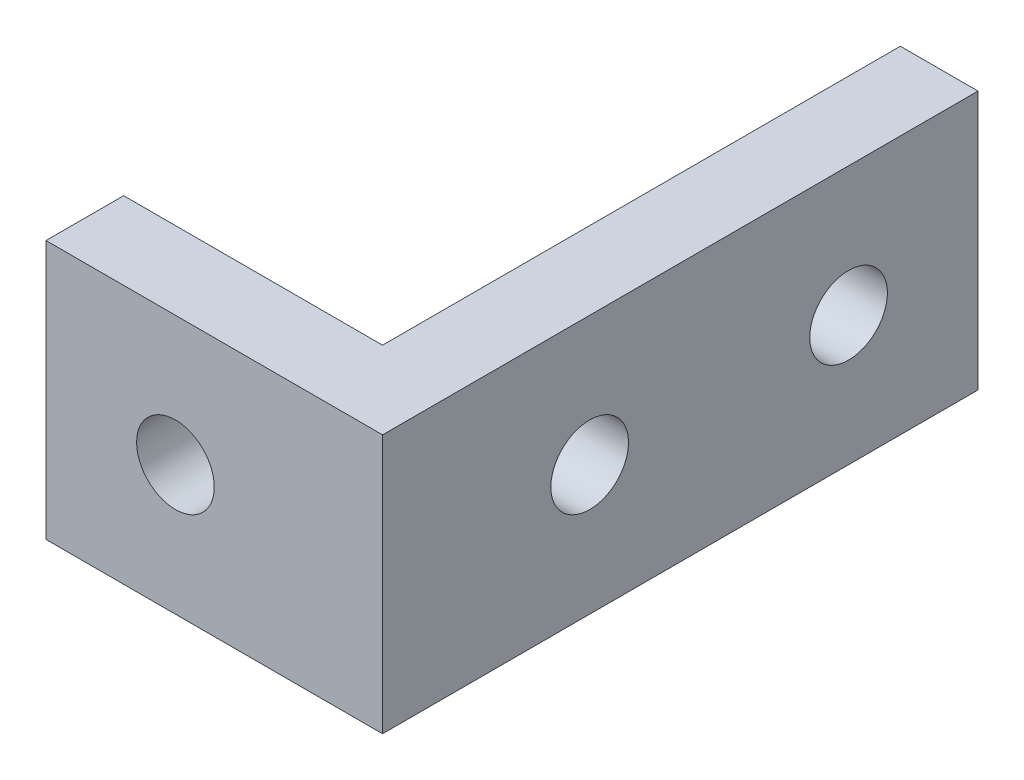
ISO-10303-21;
HEADER;
FILE_DESCRIPTION(('STEP AP214'),'2;1');
FILE_NAME('part.step','',(''),(''),'','','');
FILE_SCHEMA(('AUTOMOTIVE_DESIGN { 1 0 10303 214 1 1 1 1 }'));
ENDSEC;
DATA;
#1=APPLICATION_CONTEXT('core data for automotive mechanical design processes');
#2=APPLICATION_PROTOCOL_DEFINITION('international standard','automotive_design',2000,#1);
#3=PRODUCT_CONTEXT('',#1,'mechanical');
#4=PRODUCT('Part','Part','',(#3));
#5=PRODUCT_RELATED_PRODUCT_CATEGORY('part','',(#4));
#6=PRODUCT_DEFINITION_FORMATION('','',#4);
#7=PRODUCT_DEFINITION_CONTEXT('part definition',#1,'design');
#8=PRODUCT_DEFINITION('design','',#6,#7);
#9=PRODUCT_DEFINITION_SHAPE('','',#8);
#10=(LENGTH_UNIT() NAMED_UNIT(*) SI_UNIT(.MILLI.,.METRE.));
#11=(NAMED_UNIT(*) PLANE_ANGLE_UNIT() SI_UNIT($,.RADIAN.));
#12=(NAMED_UNIT(*) SI_UNIT($,.STERADIAN.) SOLID_ANGLE_UNIT());
#13=UNCERTAINTY_MEASURE_WITH_UNIT(LENGTH_MEASURE(1.E-05),#10,'distance_accuracy_value','');
#14=(GEOMETRIC_REPRESENTATION_CONTEXT(3) GLOBAL_UNCERTAINTY_ASSIGNED_CONTEXT((#13)) GLOBAL_UNIT_ASSIGNED_CONTEXT((#10,
#11,#12)) REPRESENTATION_CONTEXT('',''));
#15=CARTESIAN_POINT('',(0.,0.,0.));
#16=DIRECTION('',(0.,0.,1.));
#17=DIRECTION('',(1.,0.,0.));
#18=AXIS2_PLACEMENT_3D('',#15,#16,#17);
#19=CARTESIAN_POINT('',(-13.,10.,-3.));
#20=DIRECTION('',(1.,0.,0.));
#21=DIRECTION('',(0.,0.,-1.));
#22=AXIS2_PLACEMENT_3D('',#19,#20,#21);
#23=PLANE('',#22);
#24=DIRECTION('',(0.,0.,1.));
#25=VECTOR('',#24,1.);
#26=CARTESIAN_POINT('',(-13.,0.,-3.));
#27=LINE('',#26,#25);
#28=CARTESIAN_POINT('',(-13.,0.,-3.));
#29=VERTEX_POINT('',#28);
#30=CARTESIAN_POINT('',(-13.,0.,0.));
#31=VERTEX_POINT('',#30);
#32=EDGE_CURVE('E133',#29,#31,#27,.T.);
#33=ORIENTED_EDGE('',*,*,#32,.T.);
#34=DIRECTION('',(0.,-1.,0.));
#35=VECTOR('',#34,1.);
#36=CARTESIAN_POINT('',(-13.,10.,0.));
#37=LINE('',#36,#35);
#38=CARTESIAN_POINT('',(-13.,10.,0.));
#39=VERTEX_POINT('',#38);
#40=EDGE_CURVE('E11',#39,#31,#37,.T.);
#41=ORIENTED_EDGE('',*,*,#40,.F.);
#42=DIRECTION('',(0.,0.,1.));
#43=VECTOR('',#42,1.);
#44=CARTESIAN_POINT('',(-13.,10.,-3.));
#45=LINE('',#44,#43);
#46=CARTESIAN_POINT('',(-13.,10.,-3.));
#47=VERTEX_POINT('',#46);
#48=EDGE_CURVE('E151',#47,#39,#45,.T.);
#49=ORIENTED_EDGE('',*,*,#48,.F.);
#50=DIRECTION('',(0.,-1.,0.));
#51=VECTOR('',#50,1.);
#52=CARTESIAN_POINT('',(-13.,10.,-3.));
#53=LINE('',#52,#51);
#54=EDGE_CURVE('E128',#47,#29,#53,.T.);
#55=ORIENTED_EDGE('',*,*,#54,.T.);
#56=EDGE_LOOP('',(#33,#41,#49,#55));
#57=FACE_BOUND('',#56,.T.);
#58=ADVANCED_FACE('F44',(#57),#23,.F.);
#59=CARTESIAN_POINT('',(-13.,10.,0.));
#60=DIRECTION('',(0.,0.,-1.));
#61=DIRECTION('',(-1.,0.,0.));
#62=AXIS2_PLACEMENT_3D('',#59,#60,#61);
#63=PLANE('',#62);
#64=CARTESIAN_POINT('',(-8.,5.,0.));
#65=DIRECTION('',(0.,0.,-1.));
#66=DIRECTION('',(-1.,0.,0.));
#67=AXIS2_PLACEMENT_3D('',#64,#65,#66);
#68=CIRCLE('',#67,1.5);
#69=CARTESIAN_POINT('',(-9.5,5.,0.));
#70=VERTEX_POINT('',#69);
#71=EDGE_CURVE('E255',#70,#70,#68,.T.);
#72=ORIENTED_EDGE('',*,*,#71,.T.);
#73=EDGE_LOOP('',(#72));
#74=FACE_BOUND('',#73,.T.);
#75=DIRECTION('',(1.,0.,0.));
#76=VECTOR('',#75,1.);
#77=CARTESIAN_POINT('',(-13.,0.,0.));
#78=LINE('',#77,#76);
#79=CARTESIAN_POINT('',(0.,0.,0.));
#80=VERTEX_POINT('',#79);
#81=EDGE_CURVE('E136',#31,#80,#78,.T.);
#82=ORIENTED_EDGE('',*,*,#81,.T.);
#83=DIRECTION('',(0.,-1.,0.));
#84=VECTOR('',#83,1.);
#85=CARTESIAN_POINT('',(0.,10.,0.));
#86=LINE('',#85,#84);
#87=CARTESIAN_POINT('',(0.,10.,0.));
#88=VERTEX_POINT('',#87);
#89=EDGE_CURVE('E53',#88,#80,#86,.T.);
#90=ORIENTED_EDGE('',*,*,#89,.F.);
#91=DIRECTION('',(1.,0.,0.));
#92=VECTOR('',#91,1.);
#93=CARTESIAN_POINT('',(-13.,10.,0.));
#94=LINE('',#93,#92);
#95=EDGE_CURVE('E97',#39,#88,#94,.T.);
#96=ORIENTED_EDGE('',*,*,#95,.F.);
#97=ORIENTED_EDGE('',*,*,#40,.T.);
#98=EDGE_LOOP('',(#82,#90,#96,#97));
#99=FACE_BOUND('',#98,.T.);
#100=ADVANCED_FACE('F184',(#74,#99),#63,.F.);
#101=CARTESIAN_POINT('',(0.,10.,0.));
#102=DIRECTION('',(-1.,0.,0.));
#103=DIRECTION('',(0.,0.,1.));
#104=AXIS2_PLACEMENT_3D('',#101,#102,#103);
#105=PLANE('',#104);
#106=CARTESIAN_POINT('',(0.,5.,-18.));
#107=DIRECTION('',(-1.,0.,0.));
#108=DIRECTION('',(0.,0.,1.));
#109=AXIS2_PLACEMENT_3D('',#106,#107,#108);
#110=CIRCLE('',#109,1.5);
#111=CARTESIAN_POINT('',(0.,5.,-16.5));
#112=VERTEX_POINT('',#111);
#113=EDGE_CURVE('E139',#112,#112,#110,.T.);
#114=ORIENTED_EDGE('',*,*,#113,.T.);
#115=EDGE_LOOP('',(#114));
#116=FACE_BOUND('',#115,.T.);
#117=CARTESIAN_POINT('',(0.,5.,-8.00000000000001));
#118=DIRECTION('',(-1.,0.,0.));
#119=DIRECTION('',(0.,0.,1.));
#120=AXIS2_PLACEMENT_3D('',#117,#118,#119);
#121=CIRCLE('',#120,1.5);
#122=CARTESIAN_POINT('',(0.,5.,-6.50000000000001));
#123=VERTEX_POINT('',#122);
#124=EDGE_CURVE('E270',#123,#123,#121,.T.);
#125=ORIENTED_EDGE('',*,*,#124,.T.);
#126=EDGE_LOOP('',(#125));
#127=FACE_BOUND('',#126,.T.);
#128=DIRECTION('',(0.,0.,-1.));
#129=VECTOR('',#128,1.);
#130=CARTESIAN_POINT('',(0.,0.,0.));
#131=LINE('',#130,#129);
#132=CARTESIAN_POINT('',(0.,0.,-23.));
#133=VERTEX_POINT('',#132);
#134=EDGE_CURVE('E142',#80,#133,#131,.T.);
#135=ORIENTED_EDGE('',*,*,#134,.T.);
#136=DIRECTION('',(0.,-1.,0.));
#137=VECTOR('',#136,1.);
#138=CARTESIAN_POINT('',(0.,10.,-23.));
#139=LINE('',#138,#137);
#140=CARTESIAN_POINT('',(0.,10.,-23.));
#141=VERTEX_POINT('',#140);
#142=EDGE_CURVE('E121',#141,#133,#139,.T.);
#143=ORIENTED_EDGE('',*,*,#142,.F.);
#144=DIRECTION('',(0.,0.,-1.));
#145=VECTOR('',#144,1.);
#146=CARTESIAN_POINT('',(0.,10.,0.));
#147=LINE('',#146,#145);
#148=EDGE_CURVE('E115',#88,#141,#147,.T.);
#149=ORIENTED_EDGE('',*,*,#148,.F.);
#150=ORIENTED_EDGE('',*,*,#89,.T.);
#151=EDGE_LOOP('',(#135,#143,#149,#150));
#152=FACE_BOUND('',#151,.T.);
#153=ADVANCED_FACE('F161',(#116,#127,#152),#105,.F.);
#154=CARTESIAN_POINT('',(0.,10.,-23.));
#155=DIRECTION('',(0.,0.,1.));
#156=DIRECTION('',(1.,0.,0.));
#157=AXIS2_PLACEMENT_3D('',#154,#155,#156);
#158=PLANE('',#157);
#159=DIRECTION('',(-1.,0.,0.));
#160=VECTOR('',#159,1.);
#161=CARTESIAN_POINT('',(0.,0.,-23.));
#162=LINE('',#161,#160);
#163=CARTESIAN_POINT('',(-3.,0.,-23.));
#164=VERTEX_POINT('',#163);
#165=EDGE_CURVE('E123',#133,#164,#162,.T.);
#166=ORIENTED_EDGE('',*,*,#165,.T.);
#167=DIRECTION('',(0.,-1.,0.));
#168=VECTOR('',#167,1.);
#169=CARTESIAN_POINT('',(-3.,10.,-23.));
#170=LINE('',#169,#168);
#171=CARTESIAN_POINT('',(-3.,10.,-23.));
#172=VERTEX_POINT('',#171);
#173=EDGE_CURVE('E119',#172,#164,#170,.T.);
#174=ORIENTED_EDGE('',*,*,#173,.F.);
#175=DIRECTION('',(-1.,0.,0.));
#176=VECTOR('',#175,1.);
#177=CARTESIAN_POINT('',(0.,10.,-23.));
#178=LINE('',#177,#176);
#179=EDGE_CURVE('E106',#141,#172,#178,.T.);
#180=ORIENTED_EDGE('',*,*,#179,.F.);
#181=ORIENTED_EDGE('',*,*,#142,.T.);
#182=EDGE_LOOP('',(#166,#174,#180,#181));
#183=FACE_BOUND('',#182,.T.);
#184=ADVANCED_FACE('F118',(#183),#158,.F.);
#185=CARTESIAN_POINT('',(-3.,10.,-23.));
#186=DIRECTION('',(1.,0.,0.));
#187=DIRECTION('',(0.,0.,-1.));
#188=AXIS2_PLACEMENT_3D('',#185,#186,#187);
#189=PLANE('',#188);
#190=CARTESIAN_POINT('',(-3.,5.,-18.));
#191=DIRECTION('',(-1.,0.,0.));
#192=DIRECTION('',(0.,0.,1.));
#193=AXIS2_PLACEMENT_3D('',#190,#191,#192);
#194=CIRCLE('',#193,1.5);
#195=CARTESIAN_POINT('',(-3.,5.,-16.5));
#196=VERTEX_POINT('',#195);
#197=EDGE_CURVE('E261',#196,#196,#194,.T.);
#198=ORIENTED_EDGE('',*,*,#197,.F.);
#199=EDGE_LOOP('',(#198));
#200=FACE_BOUND('',#199,.T.);
#201=CARTESIAN_POINT('',(-3.,5.,-8.00000000000001));
#202=DIRECTION('',(-1.,0.,0.));
#203=DIRECTION('',(0.,0.,1.));
#204=AXIS2_PLACEMENT_3D('',#201,#202,#203);
#205=CIRCLE('',#204,1.5);
#206=CARTESIAN_POINT('',(-3.,5.,-6.50000000000001));
#207=VERTEX_POINT('',#206);
#208=EDGE_CURVE('E258',#207,#207,#205,.T.);
#209=ORIENTED_EDGE('',*,*,#208,.F.);
#210=EDGE_LOOP('',(#209));
#211=FACE_BOUND('',#210,.T.);
#212=DIRECTION('',(0.,0.,1.));
#213=VECTOR('',#212,1.);
#214=CARTESIAN_POINT('',(-3.,0.,-23.));
#215=LINE('',#214,#213);
#216=CARTESIAN_POINT('',(-3.,0.,-3.));
#217=VERTEX_POINT('',#216);
#218=EDGE_CURVE('E82',#164,#217,#215,.T.);
#219=ORIENTED_EDGE('',*,*,#218,.T.);
#220=DIRECTION('',(0.,-1.,0.));
#221=VECTOR('',#220,1.);
#222=CARTESIAN_POINT('',(-3.,10.,-3.));
#223=LINE('',#222,#221);
#224=CARTESIAN_POINT('',(-3.,10.,-3.));
#225=VERTEX_POINT('',#224);
#226=EDGE_CURVE('E124',#225,#217,#223,.T.);
#227=ORIENTED_EDGE('',*,*,#226,.F.);
#228=DIRECTION('',(0.,0.,1.));
#229=VECTOR('',#228,1.);
#230=CARTESIAN_POINT('',(-3.,10.,-23.));
#231=LINE('',#230,#229);
#232=EDGE_CURVE('E109',#172,#225,#231,.T.);
#233=ORIENTED_EDGE('',*,*,#232,.F.);
#234=ORIENTED_EDGE('',*,*,#173,.T.);
#235=EDGE_LOOP('',(#219,#227,#233,#234));
#236=FACE_BOUND('',#235,.T.);
#237=ADVANCED_FACE('F127',(#200,#211,#236),#189,.F.);
#238=CARTESIAN_POINT('',(-3.,10.,-3.));
#239=DIRECTION('',(0.,0.,1.));
#240=DIRECTION('',(1.,0.,0.));
#241=AXIS2_PLACEMENT_3D('',#238,#239,#240);
#242=PLANE('',#241);
#243=CARTESIAN_POINT('',(-8.,5.,-3.));
#244=DIRECTION('',(0.,0.,-1.));
#245=DIRECTION('',(-1.,0.,0.));
#246=AXIS2_PLACEMENT_3D('',#243,#244,#245);
#247=CIRCLE('',#246,1.5);
#248=CARTESIAN_POINT('',(-9.5,5.,-3.));
#249=VERTEX_POINT('',#248);
#250=EDGE_CURVE('E252',#249,#249,#247,.T.);
#251=ORIENTED_EDGE('',*,*,#250,.F.);
#252=EDGE_LOOP('',(#251));
#253=FACE_BOUND('',#252,.T.);
#254=DIRECTION('',(-1.,0.,0.));
#255=VECTOR('',#254,1.);
#256=CARTESIAN_POINT('',(-3.,0.,-3.));
#257=LINE('',#256,#255);
#258=EDGE_CURVE('E93',#217,#29,#257,.T.);
#259=ORIENTED_EDGE('',*,*,#258,.T.);
#260=ORIENTED_EDGE('',*,*,#54,.F.);
#261=DIRECTION('',(-1.,0.,0.));
#262=VECTOR('',#261,1.);
#263=CARTESIAN_POINT('',(-3.,10.,-3.));
#264=LINE('',#263,#262);
#265=EDGE_CURVE('E62',#225,#47,#264,.T.);
#266=ORIENTED_EDGE('',*,*,#265,.F.);
#267=ORIENTED_EDGE('',*,*,#226,.T.);
#268=EDGE_LOOP('',(#259,#260,#266,#267));
#269=FACE_BOUND('',#268,.T.);
#270=ADVANCED_FACE('F169',(#253,#269),#242,.F.);
#271=CARTESIAN_POINT('',(0.,10.,0.));
#272=DIRECTION('',(0.,1.,0.));
#273=DIRECTION('',(0.,0.,1.));
#274=AXIS2_PLACEMENT_3D('',#271,#272,#273);
#275=PLANE('',#274);
#276=ORIENTED_EDGE('',*,*,#48,.T.);
#277=ORIENTED_EDGE('',*,*,#95,.T.);
#278=ORIENTED_EDGE('',*,*,#148,.T.);
#279=ORIENTED_EDGE('',*,*,#179,.T.);
#280=ORIENTED_EDGE('',*,*,#232,.T.);
#281=ORIENTED_EDGE('',*,*,#265,.T.);
#282=EDGE_LOOP('',(#276,#277,#278,#279,#280,#281));
#283=FACE_BOUND('',#282,.T.);
#284=ADVANCED_FACE('F107',(#283),#275,.T.);
#285=CARTESIAN_POINT('',(0.,0.,0.));
#286=DIRECTION('',(0.,1.,0.));
#287=DIRECTION('',(0.,0.,1.));
#288=AXIS2_PLACEMENT_3D('',#285,#286,#287);
#289=PLANE('',#288);
#290=ORIENTED_EDGE('',*,*,#32,.F.);
#291=ORIENTED_EDGE('',*,*,#258,.F.);
#292=ORIENTED_EDGE('',*,*,#218,.F.);
#293=ORIENTED_EDGE('',*,*,#165,.F.);
#294=ORIENTED_EDGE('',*,*,#134,.F.);
#295=ORIENTED_EDGE('',*,*,#81,.F.);
#296=EDGE_LOOP('',(#290,#291,#292,#293,#294,#295));
#297=FACE_BOUND('',#296,.T.);
#298=ADVANCED_FACE('F163',(#297),#289,.F.);
#299=CARTESIAN_POINT('',(7.,5.,-8.00000000000001));
#300=DIRECTION('',(-1.,0.,0.));
#301=DIRECTION('',(0.,0.,1.));
#302=AXIS2_PLACEMENT_3D('',#299,#300,#301);
#303=CYLINDRICAL_SURFACE('',#302,1.5);
#304=ORIENTED_EDGE('',*,*,#208,.T.);
#305=EDGE_LOOP('',(#304));
#306=FACE_BOUND('',#305,.T.);
#307=ORIENTED_EDGE('',*,*,#124,.F.);
#308=EDGE_LOOP('',(#307));
#309=FACE_BOUND('',#308,.T.);
#310=ADVANCED_FACE('F215',(#306,#309),#303,.F.);
#311=CARTESIAN_POINT('',(7.,5.,-18.));
#312=DIRECTION('',(-1.,0.,0.));
#313=DIRECTION('',(0.,0.,1.));
#314=AXIS2_PLACEMENT_3D('',#311,#312,#313);
#315=CYLINDRICAL_SURFACE('',#314,1.5);
#316=ORIENTED_EDGE('',*,*,#197,.T.);
#317=EDGE_LOOP('',(#316));
#318=FACE_BOUND('',#317,.T.);
#319=ORIENTED_EDGE('',*,*,#113,.F.);
#320=EDGE_LOOP('',(#319));
#321=FACE_BOUND('',#320,.T.);
#322=ADVANCED_FACE('F227',(#318,#321),#315,.F.);
#323=CARTESIAN_POINT('',(-8.,5.,7.));
#324=DIRECTION('',(0.,0.,-1.));
#325=DIRECTION('',(-1.,0.,0.));
#326=AXIS2_PLACEMENT_3D('',#323,#324,#325);
#327=CYLINDRICAL_SURFACE('',#326,1.5);
#328=ORIENTED_EDGE('',*,*,#250,.T.);
#329=EDGE_LOOP('',(#328));
#330=FACE_BOUND('',#329,.T.);
#331=ORIENTED_EDGE('',*,*,#71,.F.);
#332=EDGE_LOOP('',(#331));
#333=FACE_BOUND('',#332,.T.);
#334=ADVANCED_FACE('F232',(#330,#333),#327,.F.);
#335=CLOSED_SHELL('',(#58,#100,#153,#184,#237,#270,#284,#298,#310,#322,#334));
#336=MANIFOLD_SOLID_BREP('B2',#335);
#337=ADVANCED_BREP_SHAPE_REPRESENTATION('',(#18,#336),#14);
#338=SHAPE_DEFINITION_REPRESENTATION(#9,#337);
ENDSEC;
END-ISO-10303-21;
